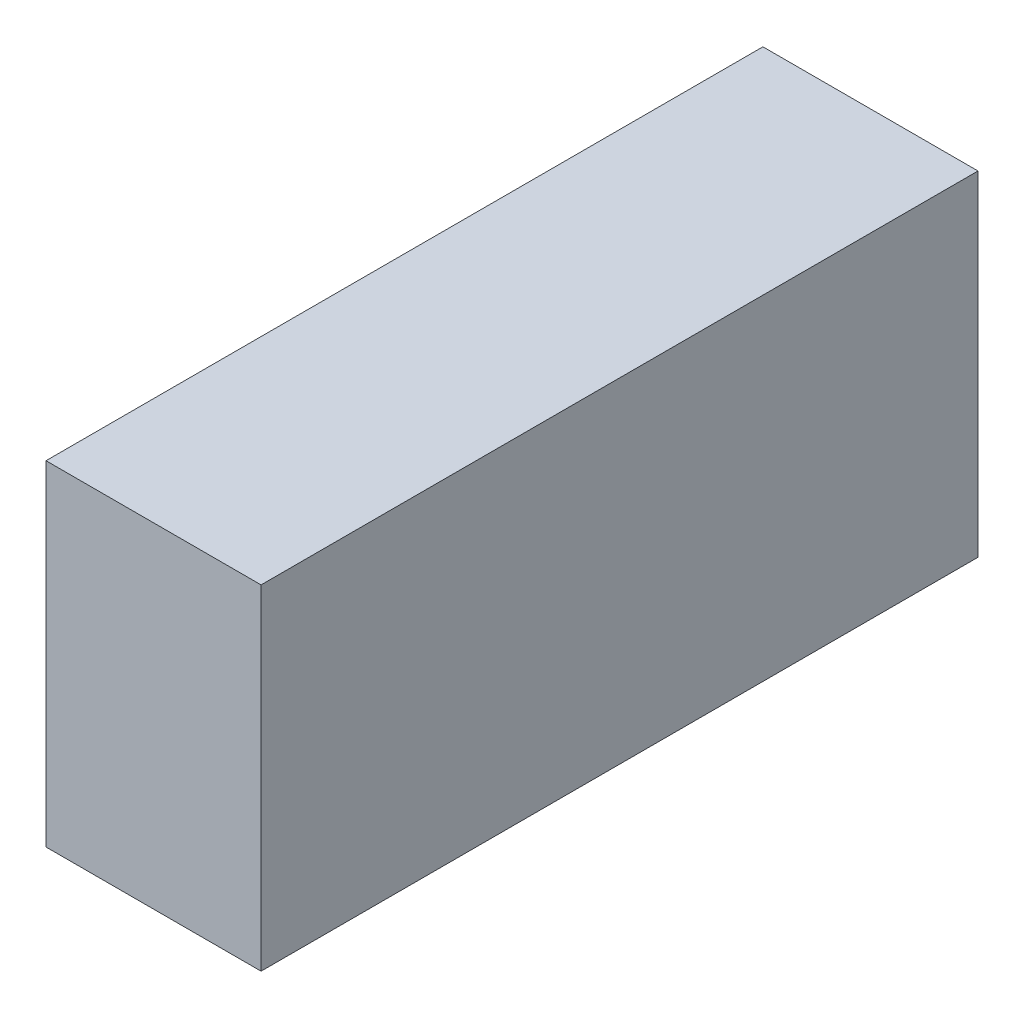
ISO-10303-21;
HEADER;
FILE_DESCRIPTION(('STEP AP214'),'2;1');
FILE_NAME('part.step','',(''),(''),'','','');
FILE_SCHEMA(('AUTOMOTIVE_DESIGN { 1 0 10303 214 1 1 1 1 }'));
ENDSEC;
DATA;
#1=APPLICATION_CONTEXT('core data for automotive mechanical design processes');
#2=APPLICATION_PROTOCOL_DEFINITION('international standard','automotive_design',2000,#1);
#3=PRODUCT_CONTEXT('',#1,'mechanical');
#4=PRODUCT('Part','Part','',(#3));
#5=PRODUCT_RELATED_PRODUCT_CATEGORY('part','',(#4));
#6=PRODUCT_DEFINITION_FORMATION('','',#4);
#7=PRODUCT_DEFINITION_CONTEXT('part definition',#1,'design');
#8=PRODUCT_DEFINITION('design','',#6,#7);
#9=PRODUCT_DEFINITION_SHAPE('','',#8);
#10=(LENGTH_UNIT() NAMED_UNIT(*) SI_UNIT(.MILLI.,.METRE.));
#11=(NAMED_UNIT(*) PLANE_ANGLE_UNIT() SI_UNIT($,.RADIAN.));
#12=(NAMED_UNIT(*) SI_UNIT($,.STERADIAN.) SOLID_ANGLE_UNIT());
#13=UNCERTAINTY_MEASURE_WITH_UNIT(LENGTH_MEASURE(1.E-05),#10,'distance_accuracy_value','');
#14=(GEOMETRIC_REPRESENTATION_CONTEXT(3) GLOBAL_UNCERTAINTY_ASSIGNED_CONTEXT((#13)) GLOBAL_UNIT_ASSIGNED_CONTEXT((#10,
#11,#12)) REPRESENTATION_CONTEXT('',''));
#15=CARTESIAN_POINT('',(0.,0.,0.));
#16=DIRECTION('',(0.,0.,1.));
#17=DIRECTION('',(1.,0.,0.));
#18=AXIS2_PLACEMENT_3D('',#15,#16,#17);
#19=CARTESIAN_POINT('',(0.899999999999999,-1.4,6.));
#20=DIRECTION('',(-1.,0.,0.));
#21=DIRECTION('',(0.,0.,1.));
#22=AXIS2_PLACEMENT_3D('',#19,#20,#21);
#23=PLANE('',#22);
#24=DIRECTION('',(0.,1.,0.));
#25=VECTOR('',#24,1.);
#26=CARTESIAN_POINT('',(0.899999999999999,-1.4,0.));
#27=LINE('',#26,#25);
#28=CARTESIAN_POINT('',(0.899999999999999,-1.4,0.));
#29=VERTEX_POINT('',#28);
#30=CARTESIAN_POINT('',(0.899999999999999,1.4,0.));
#31=VERTEX_POINT('',#30);
#32=EDGE_CURVE('E115',#29,#31,#27,.T.);
#33=ORIENTED_EDGE('',*,*,#32,.T.);
#34=DIRECTION('',(0.,0.,-1.));
#35=VECTOR('',#34,1.);
#36=CARTESIAN_POINT('',(0.899999999999999,1.4,6.));
#37=LINE('',#36,#35);
#38=CARTESIAN_POINT('',(0.899999999999999,1.4,6.));
#39=VERTEX_POINT('',#38);
#40=EDGE_CURVE('E11',#39,#31,#37,.T.);
#41=ORIENTED_EDGE('',*,*,#40,.F.);
#42=DIRECTION('',(0.,1.,0.));
#43=VECTOR('',#42,1.);
#44=CARTESIAN_POINT('',(0.899999999999999,-1.4,6.));
#45=LINE('',#44,#43);
#46=CARTESIAN_POINT('',(0.899999999999999,-1.4,6.));
#47=VERTEX_POINT('',#46);
#48=EDGE_CURVE('E99',#47,#39,#45,.T.);
#49=ORIENTED_EDGE('',*,*,#48,.F.);
#50=DIRECTION('',(0.,0.,-1.));
#51=VECTOR('',#50,1.);
#52=CARTESIAN_POINT('',(0.899999999999999,-1.4,6.));
#53=LINE('',#52,#51);
#54=EDGE_CURVE('E111',#47,#29,#53,.T.);
#55=ORIENTED_EDGE('',*,*,#54,.T.);
#56=EDGE_LOOP('',(#33,#41,#49,#55));
#57=FACE_BOUND('',#56,.T.);
#58=ADVANCED_FACE('F47',(#57),#23,.F.);
#59=CARTESIAN_POINT('',(-0.900000000000001,1.4,6.));
#60=DIRECTION('',(0.,-1.,0.));
#61=DIRECTION('',(0.,0.,-1.));
#62=AXIS2_PLACEMENT_3D('',#59,#60,#61);
#63=PLANE('',#62);
#64=DIRECTION('',(-1.,0.,0.));
#65=VECTOR('',#64,1.);
#66=CARTESIAN_POINT('',(-0.900000000000001,1.4,0.));
#67=LINE('',#66,#65);
#68=CARTESIAN_POINT('',(-0.900000000000001,1.4,0.));
#69=VERTEX_POINT('',#68);
#70=EDGE_CURVE('E104',#31,#69,#67,.T.);
#71=ORIENTED_EDGE('',*,*,#70,.T.);
#72=DIRECTION('',(0.,0.,-1.));
#73=VECTOR('',#72,1.);
#74=CARTESIAN_POINT('',(-0.900000000000001,1.4,6.));
#75=LINE('',#74,#73);
#76=CARTESIAN_POINT('',(-0.900000000000001,1.4,6.));
#77=VERTEX_POINT('',#76);
#78=EDGE_CURVE('E56',#77,#69,#75,.T.);
#79=ORIENTED_EDGE('',*,*,#78,.F.);
#80=DIRECTION('',(-1.,0.,0.));
#81=VECTOR('',#80,1.);
#82=CARTESIAN_POINT('',(-0.900000000000001,1.4,6.));
#83=LINE('',#82,#81);
#84=EDGE_CURVE('E94',#39,#77,#83,.T.);
#85=ORIENTED_EDGE('',*,*,#84,.F.);
#86=ORIENTED_EDGE('',*,*,#40,.T.);
#87=EDGE_LOOP('',(#71,#79,#85,#86));
#88=FACE_BOUND('',#87,.T.);
#89=ADVANCED_FACE('F103',(#88),#63,.F.);
#90=CARTESIAN_POINT('',(-0.900000000000001,-1.4,6.));
#91=DIRECTION('',(1.,0.,0.));
#92=DIRECTION('',(0.,0.,-1.));
#93=AXIS2_PLACEMENT_3D('',#90,#91,#92);
#94=PLANE('',#93);
#95=DIRECTION('',(0.,-1.,0.));
#96=VECTOR('',#95,1.);
#97=CARTESIAN_POINT('',(-0.900000000000001,-1.4,0.));
#98=LINE('',#97,#96);
#99=CARTESIAN_POINT('',(-0.900000000000001,-1.4,0.));
#100=VERTEX_POINT('',#99);
#101=EDGE_CURVE('E81',#69,#100,#98,.T.);
#102=ORIENTED_EDGE('',*,*,#101,.T.);
#103=DIRECTION('',(0.,0.,-1.));
#104=VECTOR('',#103,1.);
#105=CARTESIAN_POINT('',(-0.900000000000001,-1.4,6.));
#106=LINE('',#105,#104);
#107=CARTESIAN_POINT('',(-0.900000000000001,-1.4,6.));
#108=VERTEX_POINT('',#107);
#109=EDGE_CURVE('E106',#108,#100,#106,.T.);
#110=ORIENTED_EDGE('',*,*,#109,.F.);
#111=DIRECTION('',(0.,-1.,0.));
#112=VECTOR('',#111,1.);
#113=CARTESIAN_POINT('',(-0.900000000000001,-1.4,6.));
#114=LINE('',#113,#112);
#115=EDGE_CURVE('E97',#77,#108,#114,.T.);
#116=ORIENTED_EDGE('',*,*,#115,.F.);
#117=ORIENTED_EDGE('',*,*,#78,.T.);
#118=EDGE_LOOP('',(#102,#110,#116,#117));
#119=FACE_BOUND('',#118,.T.);
#120=ADVANCED_FACE('F107',(#119),#94,.F.);
#121=CARTESIAN_POINT('',(-0.900000000000001,-1.4,6.));
#122=DIRECTION('',(0.,1.,0.));
#123=DIRECTION('',(0.,0.,1.));
#124=AXIS2_PLACEMENT_3D('',#121,#122,#123);
#125=PLANE('',#124);
#126=DIRECTION('',(1.,0.,0.));
#127=VECTOR('',#126,1.);
#128=CARTESIAN_POINT('',(-0.900000000000001,-1.4,0.));
#129=LINE('',#128,#127);
#130=EDGE_CURVE('E87',#100,#29,#129,.T.);
#131=ORIENTED_EDGE('',*,*,#130,.T.);
#132=ORIENTED_EDGE('',*,*,#54,.F.);
#133=DIRECTION('',(1.,0.,0.));
#134=VECTOR('',#133,1.);
#135=CARTESIAN_POINT('',(-0.900000000000001,-1.4,6.));
#136=LINE('',#135,#134);
#137=EDGE_CURVE('E64',#108,#47,#136,.T.);
#138=ORIENTED_EDGE('',*,*,#137,.F.);
#139=ORIENTED_EDGE('',*,*,#109,.T.);
#140=EDGE_LOOP('',(#131,#132,#138,#139));
#141=FACE_BOUND('',#140,.T.);
#142=ADVANCED_FACE('F128',(#141),#125,.F.);
#143=CARTESIAN_POINT('',(0.,0.,6.));
#144=DIRECTION('',(0.,0.,-1.));
#145=DIRECTION('',(-1.,0.,0.));
#146=AXIS2_PLACEMENT_3D('',#143,#144,#145);
#147=PLANE('',#146);
#148=ORIENTED_EDGE('',*,*,#48,.T.);
#149=ORIENTED_EDGE('',*,*,#84,.T.);
#150=ORIENTED_EDGE('',*,*,#115,.T.);
#151=ORIENTED_EDGE('',*,*,#137,.T.);
#152=EDGE_LOOP('',(#148,#149,#150,#151));
#153=FACE_BOUND('',#152,.T.);
#154=ADVANCED_FACE('F95',(#153),#147,.F.);
#155=CARTESIAN_POINT('',(0.,0.,0.));
#156=DIRECTION('',(0.,0.,-1.));
#157=DIRECTION('',(-1.,0.,0.));
#158=AXIS2_PLACEMENT_3D('',#155,#156,#157);
#159=PLANE('',#158);
#160=ORIENTED_EDGE('',*,*,#32,.F.);
#161=ORIENTED_EDGE('',*,*,#130,.F.);
#162=ORIENTED_EDGE('',*,*,#101,.F.);
#163=ORIENTED_EDGE('',*,*,#70,.F.);
#164=EDGE_LOOP('',(#160,#161,#162,#163));
#165=FACE_BOUND('',#164,.T.);
#166=ADVANCED_FACE('F131',(#165),#159,.T.);
#167=CLOSED_SHELL('',(#58,#89,#120,#142,#154,#166));
#168=MANIFOLD_SOLID_BREP('B2',#167);
#169=ADVANCED_BREP_SHAPE_REPRESENTATION('',(#18,#168),#14);
#170=SHAPE_DEFINITION_REPRESENTATION(#9,#169);
ENDSEC;
END-ISO-10303-21;
